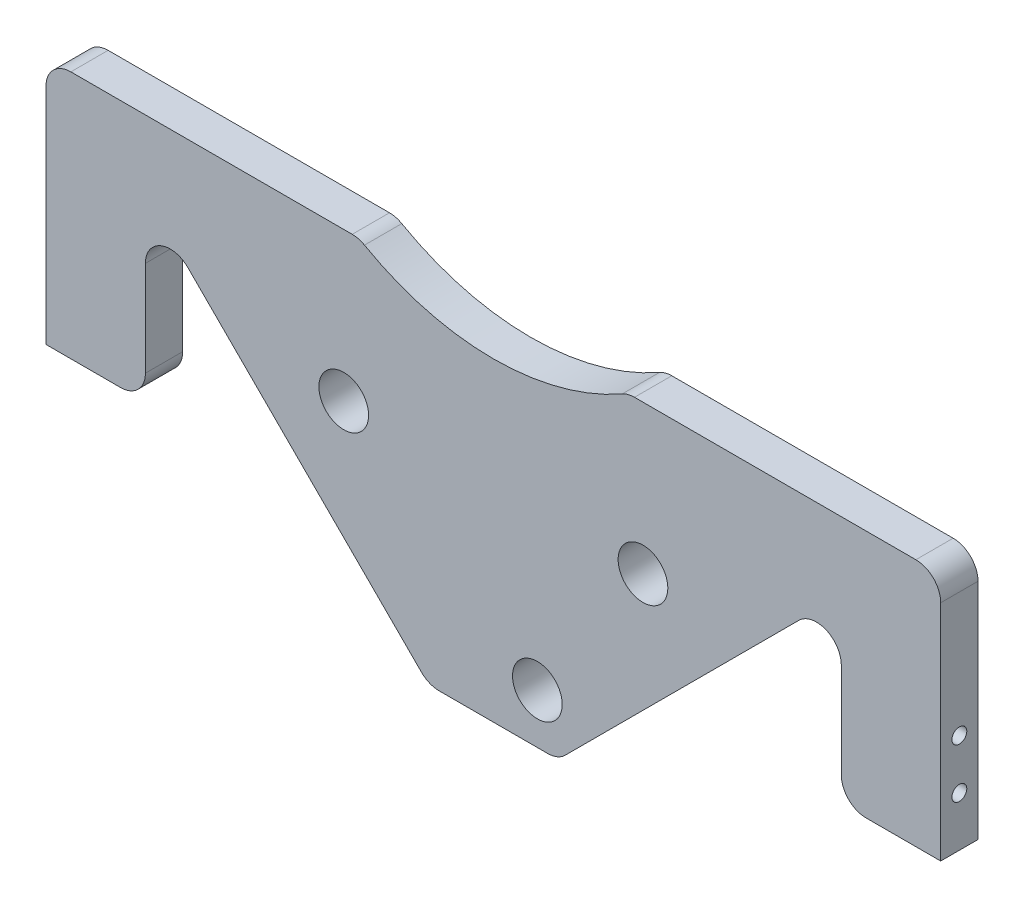
ISO-10303-21;
HEADER;
FILE_DESCRIPTION(('STEP AP214'),'2;1');
FILE_NAME('part.step','',(''),(''),'','','');
FILE_SCHEMA(('AUTOMOTIVE_DESIGN { 1 0 10303 214 1 1 1 1 }'));
ENDSEC;
DATA;
#1=APPLICATION_CONTEXT('core data for automotive mechanical design processes');
#2=APPLICATION_PROTOCOL_DEFINITION('international standard','automotive_design',2000,#1);
#3=PRODUCT_CONTEXT('',#1,'mechanical');
#4=PRODUCT('Part','Part','',(#3));
#5=PRODUCT_RELATED_PRODUCT_CATEGORY('part','',(#4));
#6=PRODUCT_DEFINITION_FORMATION('','',#4);
#7=PRODUCT_DEFINITION_CONTEXT('part definition',#1,'design');
#8=PRODUCT_DEFINITION('design','',#6,#7);
#9=PRODUCT_DEFINITION_SHAPE('','',#8);
#10=(LENGTH_UNIT() NAMED_UNIT(*) SI_UNIT(.MILLI.,.METRE.));
#11=(NAMED_UNIT(*) PLANE_ANGLE_UNIT() SI_UNIT($,.RADIAN.));
#12=(NAMED_UNIT(*) SI_UNIT($,.STERADIAN.) SOLID_ANGLE_UNIT());
#13=UNCERTAINTY_MEASURE_WITH_UNIT(LENGTH_MEASURE(1.E-05),#10,'distance_accuracy_value','');
#14=(GEOMETRIC_REPRESENTATION_CONTEXT(3) GLOBAL_UNCERTAINTY_ASSIGNED_CONTEXT((#13)) GLOBAL_UNIT_ASSIGNED_CONTEXT((#10,
#11,#12)) REPRESENTATION_CONTEXT('',''));
#15=CARTESIAN_POINT('',(0.,0.,0.));
#16=DIRECTION('',(0.,0.,1.));
#17=DIRECTION('',(1.,0.,0.));
#18=AXIS2_PLACEMENT_3D('',#15,#16,#17);
#19=CARTESIAN_POINT('',(-114.3,123.2,9.525));
#20=DIRECTION('',(0.,-1.,0.));
#21=DIRECTION('',(0.,0.,-1.));
#22=AXIS2_PLACEMENT_3D('',#19,#20,#21);
#23=PLANE('',#22);
#24=DIRECTION('',(-1.,0.,0.));
#25=VECTOR('',#24,1.);
#26=CARTESIAN_POINT('',(-114.3,123.2,9.525));
#27=LINE('',#26,#25);
#28=CARTESIAN_POINT('',(-36.0610679958317,123.2,9.525));
#29=VERTEX_POINT('',#28);
#30=CARTESIAN_POINT('',(-107.95,123.2,9.525));
#31=VERTEX_POINT('',#30);
#32=EDGE_CURVE('E287',#29,#31,#27,.T.);
#33=ORIENTED_EDGE('',*,*,#32,.F.);
#34=DIRECTION('',(0.,0.,-1.));
#35=VECTOR('',#34,1.);
#36=CARTESIAN_POINT('',(-36.0610679958317,123.2,9.525));
#37=LINE('',#36,#35);
#38=CARTESIAN_POINT('',(-36.0610679958317,123.2,0.));
#39=VERTEX_POINT('',#38);
#40=EDGE_CURVE('E389',#29,#39,#37,.T.);
#41=ORIENTED_EDGE('',*,*,#40,.T.);
#42=DIRECTION('',(-1.,0.,0.));
#43=VECTOR('',#42,1.);
#44=CARTESIAN_POINT('',(-114.3,123.2,0.));
#45=LINE('',#44,#43);
#46=CARTESIAN_POINT('',(-107.95,123.2,0.));
#47=VERTEX_POINT('',#46);
#48=EDGE_CURVE('E308',#39,#47,#45,.T.);
#49=ORIENTED_EDGE('',*,*,#48,.T.);
#50=DIRECTION('',(0.,0.,-1.));
#51=VECTOR('',#50,1.);
#52=CARTESIAN_POINT('',(-107.95,123.2,9.525));
#53=LINE('',#52,#51);
#54=EDGE_CURVE('E60',#47,#31,#53,.F.);
#55=ORIENTED_EDGE('',*,*,#54,.T.);
#56=EDGE_LOOP('',(#33,#41,#49,#55));
#57=FACE_BOUND('',#56,.T.);
#58=ADVANCED_FACE('F37',(#57),#23,.F.);
#59=CARTESIAN_POINT('',(-114.3,123.2,9.525));
#60=DIRECTION('',(1.,0.,0.));
#61=DIRECTION('',(0.,1.,0.));
#62=AXIS2_PLACEMENT_3D('',#59,#60,#61);
#63=PLANE('',#62);
#64=CARTESIAN_POINT('',(-114.3,85.1,4.7625));
#65=DIRECTION('',(-1.,0.,0.));
#66=DIRECTION('',(0.,0.,1.));
#67=AXIS2_PLACEMENT_3D('',#64,#65,#66);
#68=CIRCLE('',#67,1.89865);
#69=CARTESIAN_POINT('',(-114.3,85.1,6.66115000000001));
#70=VERTEX_POINT('',#69);
#71=EDGE_CURVE('E218',#70,#70,#68,.T.);
#72=ORIENTED_EDGE('',*,*,#71,.F.);
#73=EDGE_LOOP('',(#72));
#74=FACE_BOUND('',#73,.T.);
#75=CARTESIAN_POINT('',(-114.3,72.4,4.76250000000001));
#76=DIRECTION('',(-1.,0.,0.));
#77=DIRECTION('',(0.,0.,1.));
#78=AXIS2_PLACEMENT_3D('',#75,#76,#77);
#79=CIRCLE('',#78,1.89865);
#80=CARTESIAN_POINT('',(-114.3,72.4,6.66115000000001));
#81=VERTEX_POINT('',#80);
#82=EDGE_CURVE('E224',#81,#81,#79,.T.);
#83=ORIENTED_EDGE('',*,*,#82,.F.);
#84=EDGE_LOOP('',(#83));
#85=FACE_BOUND('',#84,.T.);
#86=DIRECTION('',(0.,-1.,0.));
#87=VECTOR('',#86,1.);
#88=CARTESIAN_POINT('',(-114.3,123.2,9.525));
#89=LINE('',#88,#87);
#90=CARTESIAN_POINT('',(-114.3,116.85,9.525));
#91=VERTEX_POINT('',#90);
#92=CARTESIAN_POINT('',(-114.3,59.7,9.525));
#93=VERTEX_POINT('',#92);
#94=EDGE_CURVE('E267',#91,#93,#89,.T.);
#95=ORIENTED_EDGE('',*,*,#94,.F.);
#96=DIRECTION('',(0.,0.,-1.));
#97=VECTOR('',#96,1.);
#98=CARTESIAN_POINT('',(-114.3,116.85,9.525));
#99=LINE('',#98,#97);
#100=CARTESIAN_POINT('',(-114.3,116.85,0.));
#101=VERTEX_POINT('',#100);
#102=EDGE_CURVE('E392',#91,#101,#99,.T.);
#103=ORIENTED_EDGE('',*,*,#102,.T.);
#104=DIRECTION('',(0.,-1.,0.));
#105=VECTOR('',#104,1.);
#106=CARTESIAN_POINT('',(-114.3,123.2,0.));
#107=LINE('',#106,#105);
#108=CARTESIAN_POINT('',(-114.3,59.7,0.));
#109=VERTEX_POINT('',#108);
#110=EDGE_CURVE('E266',#101,#109,#107,.T.);
#111=ORIENTED_EDGE('',*,*,#110,.T.);
#112=DIRECTION('',(0.,0.,-1.));
#113=VECTOR('',#112,1.);
#114=CARTESIAN_POINT('',(-114.3,59.7,9.525));
#115=LINE('',#114,#113);
#116=EDGE_CURVE('E314',#93,#109,#115,.T.);
#117=ORIENTED_EDGE('',*,*,#116,.F.);
#118=EDGE_LOOP('',(#95,#103,#111,#117));
#119=FACE_BOUND('',#118,.T.);
#120=ADVANCED_FACE('F463',(#74,#85,#119),#63,.F.);
#121=CARTESIAN_POINT('',(-114.3,59.7,9.525));
#122=DIRECTION('',(0.,1.,0.));
#123=DIRECTION('',(-1.,0.,0.));
#124=AXIS2_PLACEMENT_3D('',#121,#122,#123);
#125=PLANE('',#124);
#126=DIRECTION('',(1.,0.,0.));
#127=VECTOR('',#126,1.);
#128=CARTESIAN_POINT('',(-114.3,59.7,0.));
#129=LINE('',#128,#127);
#130=CARTESIAN_POINT('',(-95.25,59.7,0.));
#131=VERTEX_POINT('',#130);
#132=EDGE_CURVE('E291',#109,#131,#129,.T.);
#133=ORIENTED_EDGE('',*,*,#132,.T.);
#134=DIRECTION('',(0.,0.,-1.));
#135=VECTOR('',#134,1.);
#136=CARTESIAN_POINT('',(-95.25,59.7,9.525));
#137=LINE('',#136,#135);
#138=CARTESIAN_POINT('',(-95.25,59.7,9.525));
#139=VERTEX_POINT('',#138);
#140=EDGE_CURVE('E343',#131,#139,#137,.F.);
#141=ORIENTED_EDGE('',*,*,#140,.T.);
#142=DIRECTION('',(1.,0.,0.));
#143=VECTOR('',#142,1.);
#144=CARTESIAN_POINT('',(-114.3,59.7,9.525));
#145=LINE('',#144,#143);
#146=EDGE_CURVE('E269',#93,#139,#145,.T.);
#147=ORIENTED_EDGE('',*,*,#146,.F.);
#148=ORIENTED_EDGE('',*,*,#116,.T.);
#149=EDGE_LOOP('',(#133,#141,#147,#148));
#150=FACE_BOUND('',#149,.T.);
#151=ADVANCED_FACE('F468',(#150),#125,.F.);
#152=CARTESIAN_POINT('',(-16.5000122421383,33.2865174755712,9.525));
#153=DIRECTION('',(0.707106781186549,0.707106781186546,0.));
#154=DIRECTION('',(-0.707106781186546,0.707106781186549,0.));
#155=AXIS2_PLACEMENT_3D('',#152,#153,#154);
#156=PLANE('',#155);
#157=DIRECTION('',(0.707106781186546,-0.707106781186549,0.));
#158=VECTOR('',#157,1.);
#159=CARTESIAN_POINT('',(-16.5000122421383,33.2865174755712,9.525));
#160=LINE('',#159,#158);
#161=CARTESIAN_POINT('',(-78.0598719394654,94.8463771728986,9.525));
#162=VERTEX_POINT('',#161);
#163=CARTESIAN_POINT('',(-18.3598841816037,35.1463894150367,9.525));
#164=VERTEX_POINT('',#163);
#165=EDGE_CURVE('E273',#162,#164,#160,.T.);
#166=ORIENTED_EDGE('',*,*,#165,.F.);
#167=DIRECTION('',(0.,0.,-1.));
#168=VECTOR('',#167,1.);
#169=CARTESIAN_POINT('',(-78.0598719394654,94.8463771728986,0.));
#170=LINE('',#169,#168);
#171=CARTESIAN_POINT('',(-78.0598719394654,94.8463771728986,0.));
#172=VERTEX_POINT('',#171);
#173=EDGE_CURVE('E319',#162,#172,#170,.T.);
#174=ORIENTED_EDGE('',*,*,#173,.T.);
#175=DIRECTION('',(0.707106781186546,-0.707106781186549,0.));
#176=VECTOR('',#175,1.);
#177=CARTESIAN_POINT('',(-16.5000122421383,33.2865174755712,0.));
#178=LINE('',#177,#176);
#179=CARTESIAN_POINT('',(-18.3598841816037,35.1463894150367,0.));
#180=VERTEX_POINT('',#179);
#181=EDGE_CURVE('E294',#172,#180,#178,.T.);
#182=ORIENTED_EDGE('',*,*,#181,.T.);
#183=DIRECTION('',(0.,0.,-1.));
#184=VECTOR('',#183,1.);
#185=CARTESIAN_POINT('',(-18.3598841816037,35.1463894150367,9.525));
#186=LINE('',#185,#184);
#187=EDGE_CURVE('E317',#180,#164,#186,.F.);
#188=ORIENTED_EDGE('',*,*,#187,.T.);
#189=EDGE_LOOP('',(#166,#174,#182,#188));
#190=FACE_BOUND('',#189,.T.);
#191=ADVANCED_FACE('F484',(#190),#156,.F.);
#192=CARTESIAN_POINT('',(-16.5000122421383,33.2865174755712,9.525));
#193=DIRECTION('',(0.,1.,0.));
#194=DIRECTION('',(0.,0.,1.));
#195=AXIS2_PLACEMENT_3D('',#192,#193,#194);
#196=PLANE('',#195);
#197=DIRECTION('',(1.,0.,0.));
#198=VECTOR('',#197,1.);
#199=CARTESIAN_POINT('',(-16.5000122421383,33.2865174755712,0.));
#200=LINE('',#199,#198);
#201=CARTESIAN_POINT('',(-13.8697561210692,33.2865174755712,0.));
#202=VERTEX_POINT('',#201);
#203=CARTESIAN_POINT('',(13.8697561210692,33.2865174755712,0.));
#204=VERTEX_POINT('',#203);
#205=EDGE_CURVE('E297',#202,#204,#200,.T.);
#206=ORIENTED_EDGE('',*,*,#205,.T.);
#207=DIRECTION('',(0.,0.,-1.));
#208=VECTOR('',#207,1.);
#209=CARTESIAN_POINT('',(13.8697561210692,33.2865174755712,9.525));
#210=LINE('',#209,#208);
#211=CARTESIAN_POINT('',(13.8697561210692,33.2865174755712,9.525));
#212=VERTEX_POINT('',#211);
#213=EDGE_CURVE('E376',#204,#212,#210,.F.);
#214=ORIENTED_EDGE('',*,*,#213,.T.);
#215=DIRECTION('',(1.,0.,0.));
#216=VECTOR('',#215,1.);
#217=CARTESIAN_POINT('',(-16.5000122421383,33.2865174755712,9.525));
#218=LINE('',#217,#216);
#219=CARTESIAN_POINT('',(-13.8697561210692,33.2865174755712,9.525));
#220=VERTEX_POINT('',#219);
#221=EDGE_CURVE('E276',#220,#212,#218,.T.);
#222=ORIENTED_EDGE('',*,*,#221,.F.);
#223=DIRECTION('',(0.,0.,-1.));
#224=VECTOR('',#223,1.);
#225=CARTESIAN_POINT('',(-13.8697561210692,33.2865174755712,9.525));
#226=LINE('',#225,#224);
#227=EDGE_CURVE('E373',#220,#202,#226,.T.);
#228=ORIENTED_EDGE('',*,*,#227,.T.);
#229=EDGE_LOOP('',(#206,#214,#222,#228));
#230=FACE_BOUND('',#229,.T.);
#231=ADVANCED_FACE('F493',(#230),#196,.F.);
#232=CARTESIAN_POINT('',(16.5000122421383,33.2865174755712,9.525));
#233=DIRECTION('',(-0.707106781186549,0.707106781186546,0.));
#234=DIRECTION('',(-0.707106781186546,-0.707106781186549,0.));
#235=AXIS2_PLACEMENT_3D('',#232,#233,#234);
#236=PLANE('',#235);
#237=DIRECTION('',(0.707106781186546,0.707106781186549,0.));
#238=VECTOR('',#237,1.);
#239=CARTESIAN_POINT('',(16.5000122421383,33.2865174755712,0.));
#240=LINE('',#239,#238);
#241=CARTESIAN_POINT('',(18.3598841816037,35.1463894150367,0.));
#242=VERTEX_POINT('',#241);
#243=CARTESIAN_POINT('',(78.0598719394655,94.8463771728986,0.));
#244=VERTEX_POINT('',#243);
#245=EDGE_CURVE('E300',#242,#244,#240,.T.);
#246=ORIENTED_EDGE('',*,*,#245,.T.);
#247=DIRECTION('',(0.,0.,-1.));
#248=VECTOR('',#247,1.);
#249=CARTESIAN_POINT('',(78.0598719394655,94.8463771728986,9.525));
#250=LINE('',#249,#248);
#251=CARTESIAN_POINT('',(78.0598719394655,94.8463771728986,9.525));
#252=VERTEX_POINT('',#251);
#253=EDGE_CURVE('E368',#244,#252,#250,.F.);
#254=ORIENTED_EDGE('',*,*,#253,.T.);
#255=DIRECTION('',(0.707106781186546,0.707106781186549,0.));
#256=VECTOR('',#255,1.);
#257=CARTESIAN_POINT('',(16.5000122421383,33.2865174755712,9.525));
#258=LINE('',#257,#256);
#259=CARTESIAN_POINT('',(18.3598841816037,35.1463894150367,9.525));
#260=VERTEX_POINT('',#259);
#261=EDGE_CURVE('E279',#260,#252,#258,.T.);
#262=ORIENTED_EDGE('',*,*,#261,.F.);
#263=DIRECTION('',(0.,0.,-1.));
#264=VECTOR('',#263,1.);
#265=CARTESIAN_POINT('',(18.3598841816037,35.1463894150367,9.525));
#266=LINE('',#265,#264);
#267=EDGE_CURVE('E365',#260,#242,#266,.T.);
#268=ORIENTED_EDGE('',*,*,#267,.T.);
#269=EDGE_LOOP('',(#246,#254,#262,#268));
#270=FACE_BOUND('',#269,.T.);
#271=ADVANCED_FACE('F409',(#270),#236,.F.);
#272=CARTESIAN_POINT('',(42.913494766567,59.7,9.525));
#273=DIRECTION('',(0.,1.,0.));
#274=DIRECTION('',(0.,0.,1.));
#275=AXIS2_PLACEMENT_3D('',#272,#273,#274);
#276=PLANE('',#275);
#277=DIRECTION('',(1.,0.,0.));
#278=VECTOR('',#277,1.);
#279=CARTESIAN_POINT('',(42.913494766567,59.7,9.525));
#280=LINE('',#279,#278);
#281=CARTESIAN_POINT('',(95.25,59.7,9.525));
#282=VERTEX_POINT('',#281);
#283=CARTESIAN_POINT('',(114.3,59.7,9.525));
#284=VERTEX_POINT('',#283);
#285=EDGE_CURVE('E282',#282,#284,#280,.T.);
#286=ORIENTED_EDGE('',*,*,#285,.F.);
#287=DIRECTION('',(0.,0.,-1.));
#288=VECTOR('',#287,1.);
#289=CARTESIAN_POINT('',(95.25,59.7,9.525));
#290=LINE('',#289,#288);
#291=CARTESIAN_POINT('',(95.25,59.7,0.));
#292=VERTEX_POINT('',#291);
#293=EDGE_CURVE('E370',#282,#292,#290,.T.);
#294=ORIENTED_EDGE('',*,*,#293,.T.);
#295=DIRECTION('',(1.,0.,0.));
#296=VECTOR('',#295,1.);
#297=CARTESIAN_POINT('',(42.913494766567,59.7,0.));
#298=LINE('',#297,#296);
#299=CARTESIAN_POINT('',(114.3,59.7,0.));
#300=VERTEX_POINT('',#299);
#301=EDGE_CURVE('E303',#292,#300,#298,.T.);
#302=ORIENTED_EDGE('',*,*,#301,.T.);
#303=DIRECTION('',(0.,0.,-1.));
#304=VECTOR('',#303,1.);
#305=CARTESIAN_POINT('',(114.3,59.7,9.525));
#306=LINE('',#305,#304);
#307=EDGE_CURVE('E311',#284,#300,#306,.T.);
#308=ORIENTED_EDGE('',*,*,#307,.F.);
#309=EDGE_LOOP('',(#286,#294,#302,#308));
#310=FACE_BOUND('',#309,.T.);
#311=ADVANCED_FACE('F427',(#310),#276,.F.);
#312=CARTESIAN_POINT('',(114.3,123.2,9.525));
#313=DIRECTION('',(-1.,0.,0.));
#314=DIRECTION('',(0.,-1.,0.));
#315=AXIS2_PLACEMENT_3D('',#312,#313,#314);
#316=PLANE('',#315);
#317=CARTESIAN_POINT('',(114.3,85.1,4.7625));
#318=DIRECTION('',(1.,0.,0.));
#319=DIRECTION('',(0.,0.,-1.));
#320=AXIS2_PLACEMENT_3D('',#317,#318,#319);
#321=CIRCLE('',#320,1.89865);
#322=CARTESIAN_POINT('',(114.3,85.1,2.86385));
#323=VERTEX_POINT('',#322);
#324=EDGE_CURVE('E208',#323,#323,#321,.T.);
#325=ORIENTED_EDGE('',*,*,#324,.F.);
#326=EDGE_LOOP('',(#325));
#327=FACE_BOUND('',#326,.T.);
#328=CARTESIAN_POINT('',(114.3,72.4,4.76250000000001));
#329=DIRECTION('',(1.,0.,0.));
#330=DIRECTION('',(0.,0.,-1.));
#331=AXIS2_PLACEMENT_3D('',#328,#329,#330);
#332=CIRCLE('',#331,1.89865);
#333=CARTESIAN_POINT('',(114.3,72.4,2.86385));
#334=VERTEX_POINT('',#333);
#335=EDGE_CURVE('E207',#334,#334,#332,.T.);
#336=ORIENTED_EDGE('',*,*,#335,.F.);
#337=EDGE_LOOP('',(#336));
#338=FACE_BOUND('',#337,.T.);
#339=DIRECTION('',(0.,1.,0.));
#340=VECTOR('',#339,1.);
#341=CARTESIAN_POINT('',(114.3,123.2,0.));
#342=LINE('',#341,#340);
#343=CARTESIAN_POINT('',(114.3,116.85,0.));
#344=VERTEX_POINT('',#343);
#345=EDGE_CURVE('E305',#300,#344,#342,.T.);
#346=ORIENTED_EDGE('',*,*,#345,.T.);
#347=DIRECTION('',(0.,0.,-1.));
#348=VECTOR('',#347,1.);
#349=CARTESIAN_POINT('',(114.3,116.85,9.525));
#350=LINE('',#349,#348);
#351=CARTESIAN_POINT('',(114.3,116.85,9.525));
#352=VERTEX_POINT('',#351);
#353=EDGE_CURVE('E395',#344,#352,#350,.F.);
#354=ORIENTED_EDGE('',*,*,#353,.T.);
#355=DIRECTION('',(0.,1.,0.));
#356=VECTOR('',#355,1.);
#357=CARTESIAN_POINT('',(114.3,123.2,9.525));
#358=LINE('',#357,#356);
#359=EDGE_CURVE('E284',#284,#352,#358,.T.);
#360=ORIENTED_EDGE('',*,*,#359,.F.);
#361=ORIENTED_EDGE('',*,*,#307,.T.);
#362=EDGE_LOOP('',(#346,#354,#360,#361));
#363=FACE_BOUND('',#362,.T.);
#364=ADVANCED_FACE('F432',(#327,#338,#363),#316,.F.);
#365=CARTESIAN_POINT('',(107.95,123.2,0.));
#366=VERTEX_POINT('',#365);
#367=CARTESIAN_POINT('',(36.0610679958317,123.2,0.));
#368=VERTEX_POINT('',#367);
#369=EDGE_CURVE('E270',#366,#368,#45,.T.);
#370=ORIENTED_EDGE('',*,*,#369,.T.);
#371=DIRECTION('',(0.,0.,-1.));
#372=VECTOR('',#371,1.);
#373=CARTESIAN_POINT('',(36.0610679958317,123.2,9.525));
#374=LINE('',#373,#372);
#375=CARTESIAN_POINT('',(36.0610679958317,123.2,9.525));
#376=VERTEX_POINT('',#375);
#377=EDGE_CURVE('E381',#368,#376,#374,.F.);
#378=ORIENTED_EDGE('',*,*,#377,.T.);
#379=CARTESIAN_POINT('',(107.95,123.2,9.525));
#380=VERTEX_POINT('',#379);
#381=EDGE_CURVE('E289',#380,#376,#27,.T.);
#382=ORIENTED_EDGE('',*,*,#381,.F.);
#383=DIRECTION('',(0.,0.,-1.));
#384=VECTOR('',#383,1.);
#385=CARTESIAN_POINT('',(107.95,123.2,9.525));
#386=LINE('',#385,#384);
#387=EDGE_CURVE('E378',#380,#366,#386,.T.);
#388=ORIENTED_EDGE('',*,*,#387,.T.);
#389=EDGE_LOOP('',(#370,#378,#382,#388));
#390=FACE_BOUND('',#389,.T.);
#391=ADVANCED_FACE('F441',(#390),#23,.F.);
#392=CARTESIAN_POINT('',(0.,0.,9.525));
#393=DIRECTION('',(0.,0.,1.));
#394=DIRECTION('',(1.,0.,0.));
#395=AXIS2_PLACEMENT_3D('',#392,#393,#394);
#396=PLANE('',#395);
#397=ORIENTED_EDGE('',*,*,#146,.T.);
#398=CARTESIAN_POINT('',(-95.25,66.05,9.525));
#399=DIRECTION('',(0.,0.,1.));
#400=DIRECTION('',(1.,0.,0.));
#401=AXIS2_PLACEMENT_3D('',#398,#399,#400);
#402=CIRCLE('',#401,6.35);
#403=CARTESIAN_POINT('',(-88.9,66.05,9.525));
#404=VERTEX_POINT('',#403);
#405=EDGE_CURVE('E358',#139,#404,#402,.T.);
#406=ORIENTED_EDGE('',*,*,#405,.T.);
#407=DIRECTION('',(0.,1.,0.));
#408=VECTOR('',#407,1.);
#409=CARTESIAN_POINT('',(-88.9,105.686505233433,9.525));
#410=LINE('',#409,#408);
#411=CARTESIAN_POINT('',(-88.9,90.3562491123641,9.525));
#412=VERTEX_POINT('',#411);
#413=EDGE_CURVE('E231',#404,#412,#410,.T.);
#414=ORIENTED_EDGE('',*,*,#413,.T.);
#415=CARTESIAN_POINT('',(-82.55,90.3562491123641,9.525));
#416=DIRECTION('',(0.,0.,1.));
#417=DIRECTION('',(1.,0.,0.));
#418=AXIS2_PLACEMENT_3D('',#415,#416,#417);
#419=CIRCLE('',#418,6.35);
#420=EDGE_CURVE('E399',#412,#162,#419,.F.);
#421=ORIENTED_EDGE('',*,*,#420,.T.);
#422=ORIENTED_EDGE('',*,*,#165,.T.);
#423=CARTESIAN_POINT('',(-13.8697561210692,39.6365174755712,9.525));
#424=DIRECTION('',(0.,0.,1.));
#425=DIRECTION('',(1.,0.,0.));
#426=AXIS2_PLACEMENT_3D('',#423,#424,#425);
#427=CIRCLE('',#426,6.35);
#428=EDGE_CURVE('E352',#164,#220,#427,.T.);
#429=ORIENTED_EDGE('',*,*,#428,.T.);
#430=ORIENTED_EDGE('',*,*,#221,.T.);
#431=CARTESIAN_POINT('',(13.8697561210692,39.6365174755712,9.525));
#432=DIRECTION('',(0.,0.,1.));
#433=DIRECTION('',(1.,0.,0.));
#434=AXIS2_PLACEMENT_3D('',#431,#432,#433);
#435=CIRCLE('',#434,6.35);
#436=EDGE_CURVE('E354',#212,#260,#435,.T.);
#437=ORIENTED_EDGE('',*,*,#436,.T.);
#438=ORIENTED_EDGE('',*,*,#261,.T.);
#439=CARTESIAN_POINT('',(82.55,90.356249112364,9.525));
#440=DIRECTION('',(0.,0.,1.));
#441=DIRECTION('',(1.,0.,0.));
#442=AXIS2_PLACEMENT_3D('',#439,#440,#441);
#443=CIRCLE('',#442,6.35);
#444=CARTESIAN_POINT('',(88.9,90.356249112364,9.525));
#445=VERTEX_POINT('',#444);
#446=EDGE_CURVE('E11',#252,#445,#443,.F.);
#447=ORIENTED_EDGE('',*,*,#446,.T.);
#448=DIRECTION('',(0.,-1.,0.));
#449=VECTOR('',#448,1.);
#450=CARTESIAN_POINT('',(88.9,105.686505233433,9.525));
#451=LINE('',#450,#449);
#452=CARTESIAN_POINT('',(88.9,66.05,9.525));
#453=VERTEX_POINT('',#452);
#454=EDGE_CURVE('E238',#445,#453,#451,.T.);
#455=ORIENTED_EDGE('',*,*,#454,.T.);
#456=CARTESIAN_POINT('',(95.25,66.05,9.525));
#457=DIRECTION('',(0.,0.,1.));
#458=DIRECTION('',(1.,0.,0.));
#459=AXIS2_PLACEMENT_3D('',#456,#457,#458);
#460=CIRCLE('',#459,6.35);
#461=EDGE_CURVE('E356',#453,#282,#460,.T.);
#462=ORIENTED_EDGE('',*,*,#461,.T.);
#463=ORIENTED_EDGE('',*,*,#285,.T.);
#464=ORIENTED_EDGE('',*,*,#359,.T.);
#465=CARTESIAN_POINT('',(107.95,116.85,9.525));
#466=DIRECTION('',(0.,0.,1.));
#467=DIRECTION('',(1.,0.,0.));
#468=AXIS2_PLACEMENT_3D('',#465,#466,#467);
#469=CIRCLE('',#468,6.35);
#470=EDGE_CURVE('E345',#352,#380,#469,.T.);
#471=ORIENTED_EDGE('',*,*,#470,.T.);
#472=ORIENTED_EDGE('',*,*,#381,.T.);
#473=CARTESIAN_POINT('',(36.0610679958317,116.85,9.525));
#474=DIRECTION('',(0.,0.,1.));
#475=DIRECTION('',(1.,0.,0.));
#476=AXIS2_PLACEMENT_3D('',#473,#474,#475);
#477=CIRCLE('',#476,6.35);
#478=CARTESIAN_POINT('',(32.9253229527159,122.371739130435,9.525));
#479=VERTEX_POINT('',#478);
#480=EDGE_CURVE('E350',#376,#479,#477,.T.);
#481=ORIENTED_EDGE('',*,*,#480,.T.);
#482=CARTESIAN_POINT('',(0.,180.35,9.525));
#483=DIRECTION('',(0.,0.,-1.));
#484=DIRECTION('',(-1.,0.,0.));
#485=AXIS2_PLACEMENT_3D('',#482,#483,#484);
#486=CIRCLE('',#485,66.675);
#487=CARTESIAN_POINT('',(-32.9253229527159,122.371739130435,9.525));
#488=VERTEX_POINT('',#487);
#489=EDGE_CURVE('E243',#479,#488,#486,.T.);
#490=ORIENTED_EDGE('',*,*,#489,.T.);
#491=CARTESIAN_POINT('',(-36.0610679958317,116.85,9.525));
#492=DIRECTION('',(0.,0.,1.));
#493=DIRECTION('',(1.,0.,0.));
#494=AXIS2_PLACEMENT_3D('',#491,#492,#493);
#495=CIRCLE('',#494,6.35);
#496=EDGE_CURVE('E348',#488,#29,#495,.T.);
#497=ORIENTED_EDGE('',*,*,#496,.T.);
#498=ORIENTED_EDGE('',*,*,#32,.T.);
#499=CARTESIAN_POINT('',(-107.95,116.85,9.525));
#500=DIRECTION('',(0.,0.,1.));
#501=DIRECTION('',(1.,0.,0.));
#502=AXIS2_PLACEMENT_3D('',#499,#500,#501);
#503=CIRCLE('',#502,6.35);
#504=EDGE_CURVE('E52',#31,#91,#503,.T.);
#505=ORIENTED_EDGE('',*,*,#504,.T.);
#506=ORIENTED_EDGE('',*,*,#94,.T.);
#507=EDGE_LOOP('',(#397,#406,#414,#421,#422,#429,#430,#437,#438,#447,#455,#462,#463,#464,#471,
#472,#481,#490,#497,#498,#505,#506));
#508=FACE_BOUND('',#507,.T.);
#509=CARTESIAN_POINT('',(-38.227,85.227,9.525));
#510=DIRECTION('',(0.,0.,1.));
#511=DIRECTION('',(1.,0.,0.));
#512=AXIS2_PLACEMENT_3D('',#509,#510,#511);
#513=CIRCLE('',#512,6.35);
#514=CARTESIAN_POINT('',(-31.877,85.227,9.525));
#515=VERTEX_POINT('',#514);
#516=EDGE_CURVE('E246',#515,#515,#513,.T.);
#517=ORIENTED_EDGE('',*,*,#516,.F.);
#518=EDGE_LOOP('',(#517));
#519=FACE_BOUND('',#518,.T.);
#520=CARTESIAN_POINT('',(38.227,85.227,9.525));
#521=DIRECTION('',(0.,0.,1.));
#522=DIRECTION('',(1.,0.,0.));
#523=AXIS2_PLACEMENT_3D('',#520,#521,#522);
#524=CIRCLE('',#523,6.35);
#525=CARTESIAN_POINT('',(44.577,85.227,9.525));
#526=VERTEX_POINT('',#525);
#527=EDGE_CURVE('E254',#526,#526,#524,.T.);
#528=ORIENTED_EDGE('',*,*,#527,.F.);
#529=EDGE_LOOP('',(#528));
#530=FACE_BOUND('',#529,.T.);
#531=CARTESIAN_POINT('',(11.2395,45.9865174755712,9.525));
#532=DIRECTION('',(0.,0.,1.));
#533=DIRECTION('',(1.,0.,0.));
#534=AXIS2_PLACEMENT_3D('',#531,#532,#533);
#535=CIRCLE('',#534,6.35);
#536=CARTESIAN_POINT('',(17.5895,45.9865174755712,9.525));
#537=VERTEX_POINT('',#536);
#538=EDGE_CURVE('E260',#537,#537,#535,.T.);
#539=ORIENTED_EDGE('',*,*,#538,.F.);
#540=EDGE_LOOP('',(#539));
#541=FACE_BOUND('',#540,.T.);
#542=ADVANCED_FACE('F415',(#508,#519,#530,#541),#396,.T.);
#543=CARTESIAN_POINT('',(0.,0.,0.));
#544=DIRECTION('',(0.,0.,1.));
#545=DIRECTION('',(1.,0.,0.));
#546=AXIS2_PLACEMENT_3D('',#543,#544,#545);
#547=PLANE('',#546);
#548=CARTESIAN_POINT('',(-38.227,85.227,0.));
#549=DIRECTION('',(0.,0.,1.));
#550=DIRECTION('',(1.,0.,0.));
#551=AXIS2_PLACEMENT_3D('',#548,#549,#550);
#552=CIRCLE('',#551,6.35);
#553=CARTESIAN_POINT('',(-31.877,85.227,0.));
#554=VERTEX_POINT('',#553);
#555=EDGE_CURVE('E251',#554,#554,#552,.T.);
#556=ORIENTED_EDGE('',*,*,#555,.T.);
#557=EDGE_LOOP('',(#556));
#558=FACE_BOUND('',#557,.T.);
#559=CARTESIAN_POINT('',(38.227,85.227,0.));
#560=DIRECTION('',(0.,0.,1.));
#561=DIRECTION('',(1.,0.,0.));
#562=AXIS2_PLACEMENT_3D('',#559,#560,#561);
#563=CIRCLE('',#562,6.35);
#564=CARTESIAN_POINT('',(44.577,85.227,0.));
#565=VERTEX_POINT('',#564);
#566=EDGE_CURVE('E257',#565,#565,#563,.T.);
#567=ORIENTED_EDGE('',*,*,#566,.T.);
#568=EDGE_LOOP('',(#567));
#569=FACE_BOUND('',#568,.T.);
#570=CARTESIAN_POINT('',(11.2395,45.9865174755712,0.));
#571=DIRECTION('',(0.,0.,1.));
#572=DIRECTION('',(1.,0.,0.));
#573=AXIS2_PLACEMENT_3D('',#570,#571,#572);
#574=CIRCLE('',#573,6.35);
#575=CARTESIAN_POINT('',(17.5895,45.9865174755712,0.));
#576=VERTEX_POINT('',#575);
#577=EDGE_CURVE('E263',#576,#576,#574,.T.);
#578=ORIENTED_EDGE('',*,*,#577,.T.);
#579=EDGE_LOOP('',(#578));
#580=FACE_BOUND('',#579,.T.);
#581=DIRECTION('',(0.,1.,0.));
#582=VECTOR('',#581,1.);
#583=CARTESIAN_POINT('',(-88.9,105.686505233433,0.));
#584=LINE('',#583,#582);
#585=CARTESIAN_POINT('',(-88.9,66.05,0.));
#586=VERTEX_POINT('',#585);
#587=CARTESIAN_POINT('',(-88.9,90.3562491123641,0.));
#588=VERTEX_POINT('',#587);
#589=EDGE_CURVE('E235',#586,#588,#584,.T.);
#590=ORIENTED_EDGE('',*,*,#589,.F.);
#591=CARTESIAN_POINT('',(-95.25,66.05,0.));
#592=DIRECTION('',(0.,0.,1.));
#593=DIRECTION('',(1.,0.,0.));
#594=AXIS2_PLACEMENT_3D('',#591,#592,#593);
#595=CIRCLE('',#594,6.35);
#596=EDGE_CURVE('E341',#586,#131,#595,.F.);
#597=ORIENTED_EDGE('',*,*,#596,.T.);
#598=ORIENTED_EDGE('',*,*,#132,.F.);
#599=ORIENTED_EDGE('',*,*,#110,.F.);
#600=CARTESIAN_POINT('',(-107.95,116.85,0.));
#601=DIRECTION('',(0.,0.,1.));
#602=DIRECTION('',(1.,0.,0.));
#603=AXIS2_PLACEMENT_3D('',#600,#601,#602);
#604=CIRCLE('',#603,6.35);
#605=EDGE_CURVE('E329',#101,#47,#604,.F.);
#606=ORIENTED_EDGE('',*,*,#605,.T.);
#607=ORIENTED_EDGE('',*,*,#48,.F.);
#608=CARTESIAN_POINT('',(-36.0610679958317,116.85,0.));
#609=DIRECTION('',(0.,0.,1.));
#610=DIRECTION('',(1.,0.,0.));
#611=AXIS2_PLACEMENT_3D('',#608,#609,#610);
#612=CIRCLE('',#611,6.35);
#613=CARTESIAN_POINT('',(-32.9253229527159,122.371739130435,0.));
#614=VERTEX_POINT('',#613);
#615=EDGE_CURVE('E331',#39,#614,#612,.F.);
#616=ORIENTED_EDGE('',*,*,#615,.T.);
#617=CARTESIAN_POINT('',(0.,180.35,0.));
#618=DIRECTION('',(0.,0.,-1.));
#619=DIRECTION('',(-1.,0.,0.));
#620=AXIS2_PLACEMENT_3D('',#617,#618,#619);
#621=CIRCLE('',#620,66.675);
#622=CARTESIAN_POINT('',(32.9253229527159,122.371739130435,0.));
#623=VERTEX_POINT('',#622);
#624=EDGE_CURVE('E234',#623,#614,#621,.T.);
#625=ORIENTED_EDGE('',*,*,#624,.F.);
#626=CARTESIAN_POINT('',(36.0610679958317,116.85,0.));
#627=DIRECTION('',(0.,0.,1.));
#628=DIRECTION('',(1.,0.,0.));
#629=AXIS2_PLACEMENT_3D('',#626,#627,#628);
#630=CIRCLE('',#629,6.35);
#631=EDGE_CURVE('E333',#623,#368,#630,.F.);
#632=ORIENTED_EDGE('',*,*,#631,.T.);
#633=ORIENTED_EDGE('',*,*,#369,.F.);
#634=CARTESIAN_POINT('',(107.95,116.85,0.));
#635=DIRECTION('',(0.,0.,1.));
#636=DIRECTION('',(1.,0.,0.));
#637=AXIS2_PLACEMENT_3D('',#634,#635,#636);
#638=CIRCLE('',#637,6.35);
#639=EDGE_CURVE('E327',#366,#344,#638,.F.);
#640=ORIENTED_EDGE('',*,*,#639,.T.);
#641=ORIENTED_EDGE('',*,*,#345,.F.);
#642=ORIENTED_EDGE('',*,*,#301,.F.);
#643=CARTESIAN_POINT('',(95.25,66.05,0.));
#644=DIRECTION('',(0.,0.,1.));
#645=DIRECTION('',(1.,0.,0.));
#646=AXIS2_PLACEMENT_3D('',#643,#644,#645);
#647=CIRCLE('',#646,6.35);
#648=CARTESIAN_POINT('',(88.9,66.05,0.));
#649=VERTEX_POINT('',#648);
#650=EDGE_CURVE('E339',#292,#649,#647,.F.);
#651=ORIENTED_EDGE('',*,*,#650,.T.);
#652=DIRECTION('',(0.,-1.,0.));
#653=VECTOR('',#652,1.);
#654=CARTESIAN_POINT('',(88.9,105.686505233433,0.));
#655=LINE('',#654,#653);
#656=CARTESIAN_POINT('',(88.9,90.356249112364,0.));
#657=VERTEX_POINT('',#656);
#658=EDGE_CURVE('E230',#657,#649,#655,.T.);
#659=ORIENTED_EDGE('',*,*,#658,.F.);
#660=CARTESIAN_POINT('',(82.55,90.356249112364,0.));
#661=DIRECTION('',(0.,0.,1.));
#662=DIRECTION('',(1.,0.,0.));
#663=AXIS2_PLACEMENT_3D('',#660,#661,#662);
#664=CIRCLE('',#663,6.35);
#665=EDGE_CURVE('E45',#657,#244,#664,.T.);
#666=ORIENTED_EDGE('',*,*,#665,.T.);
#667=ORIENTED_EDGE('',*,*,#245,.F.);
#668=CARTESIAN_POINT('',(13.8697561210692,39.6365174755712,0.));
#669=DIRECTION('',(0.,0.,1.));
#670=DIRECTION('',(1.,0.,0.));
#671=AXIS2_PLACEMENT_3D('',#668,#669,#670);
#672=CIRCLE('',#671,6.35);
#673=EDGE_CURVE('E337',#242,#204,#672,.F.);
#674=ORIENTED_EDGE('',*,*,#673,.T.);
#675=ORIENTED_EDGE('',*,*,#205,.F.);
#676=CARTESIAN_POINT('',(-13.8697561210692,39.6365174755712,0.));
#677=DIRECTION('',(0.,0.,1.));
#678=DIRECTION('',(1.,0.,0.));
#679=AXIS2_PLACEMENT_3D('',#676,#677,#678);
#680=CIRCLE('',#679,6.35);
#681=EDGE_CURVE('E335',#202,#180,#680,.F.);
#682=ORIENTED_EDGE('',*,*,#681,.T.);
#683=ORIENTED_EDGE('',*,*,#181,.F.);
#684=CARTESIAN_POINT('',(-82.55,90.3562491123641,0.));
#685=DIRECTION('',(0.,0.,1.));
#686=DIRECTION('',(1.,0.,0.));
#687=AXIS2_PLACEMENT_3D('',#684,#685,#686);
#688=CIRCLE('',#687,6.35);
#689=EDGE_CURVE('E397',#172,#588,#688,.T.);
#690=ORIENTED_EDGE('',*,*,#689,.T.);
#691=EDGE_LOOP('',(#590,#597,#598,#599,#606,#607,#616,#625,#632,#633,#640,#641,#642,#651,#659,
#666,#667,#674,#675,#682,#683,#690));
#692=FACE_BOUND('',#691,.T.);
#693=ADVANCED_FACE('F404',(#558,#569,#580,#692),#547,.F.);
#694=CARTESIAN_POINT('',(11.2395,45.9865174755712,9.525));
#695=DIRECTION('',(0.,0.,1.));
#696=DIRECTION('',(1.,0.,0.));
#697=AXIS2_PLACEMENT_3D('',#694,#695,#696);
#698=CYLINDRICAL_SURFACE('',#697,6.35);
#699=ORIENTED_EDGE('',*,*,#577,.F.);
#700=EDGE_LOOP('',(#699));
#701=FACE_BOUND('',#700,.T.);
#702=ORIENTED_EDGE('',*,*,#538,.T.);
#703=EDGE_LOOP('',(#702));
#704=FACE_BOUND('',#703,.T.);
#705=ADVANCED_FACE('F702',(#701,#704),#698,.F.);
#706=CARTESIAN_POINT('',(38.227,85.227,9.525));
#707=DIRECTION('',(0.,0.,1.));
#708=DIRECTION('',(1.,0.,0.));
#709=AXIS2_PLACEMENT_3D('',#706,#707,#708);
#710=CYLINDRICAL_SURFACE('',#709,6.35);
#711=ORIENTED_EDGE('',*,*,#566,.F.);
#712=EDGE_LOOP('',(#711));
#713=FACE_BOUND('',#712,.T.);
#714=ORIENTED_EDGE('',*,*,#527,.T.);
#715=EDGE_LOOP('',(#714));
#716=FACE_BOUND('',#715,.T.);
#717=ADVANCED_FACE('F698',(#713,#716),#710,.F.);
#718=CARTESIAN_POINT('',(-38.227,85.227,9.525));
#719=DIRECTION('',(0.,0.,1.));
#720=DIRECTION('',(1.,0.,0.));
#721=AXIS2_PLACEMENT_3D('',#718,#719,#720);
#722=CYLINDRICAL_SURFACE('',#721,6.35);
#723=ORIENTED_EDGE('',*,*,#555,.F.);
#724=EDGE_LOOP('',(#723));
#725=FACE_BOUND('',#724,.T.);
#726=ORIENTED_EDGE('',*,*,#516,.T.);
#727=EDGE_LOOP('',(#726));
#728=FACE_BOUND('',#727,.T.);
#729=ADVANCED_FACE('F695',(#725,#728),#722,.F.);
#730=CARTESIAN_POINT('',(0.,180.35,9.525));
#731=DIRECTION('',(0.,0.,-1.));
#732=DIRECTION('',(-1.,0.,0.));
#733=AXIS2_PLACEMENT_3D('',#730,#731,#732);
#734=CYLINDRICAL_SURFACE('',#733,66.675);
#735=ORIENTED_EDGE('',*,*,#489,.F.);
#736=DIRECTION('',(0.,0.,-1.));
#737=VECTOR('',#736,1.);
#738=CARTESIAN_POINT('',(32.9253229527159,122.371739130435,9.525));
#739=LINE('',#738,#737);
#740=EDGE_CURVE('E386',#479,#623,#739,.T.);
#741=ORIENTED_EDGE('',*,*,#740,.T.);
#742=ORIENTED_EDGE('',*,*,#624,.T.);
#743=DIRECTION('',(0.,0.,-1.));
#744=VECTOR('',#743,1.);
#745=CARTESIAN_POINT('',(-32.9253229527159,122.371739130435,9.525));
#746=LINE('',#745,#744);
#747=EDGE_CURVE('E384',#614,#488,#746,.F.);
#748=ORIENTED_EDGE('',*,*,#747,.T.);
#749=EDGE_LOOP('',(#735,#741,#742,#748));
#750=FACE_BOUND('',#749,.T.);
#751=ADVANCED_FACE('F451',(#750),#734,.F.);
#752=CARTESIAN_POINT('',(88.9,105.686505233433,9.525));
#753=DIRECTION('',(1.,0.,0.));
#754=DIRECTION('',(0.,0.,-1.));
#755=AXIS2_PLACEMENT_3D('',#752,#753,#754);
#756=PLANE('',#755);
#757=ORIENTED_EDGE('',*,*,#454,.F.);
#758=DIRECTION('',(0.,0.,-1.));
#759=VECTOR('',#758,1.);
#760=CARTESIAN_POINT('',(88.9,90.356249112364,0.));
#761=LINE('',#760,#759);
#762=EDGE_CURVE('E362',#445,#657,#761,.T.);
#763=ORIENTED_EDGE('',*,*,#762,.T.);
#764=ORIENTED_EDGE('',*,*,#658,.T.);
#765=DIRECTION('',(0.,0.,-1.));
#766=VECTOR('',#765,1.);
#767=CARTESIAN_POINT('',(88.9,66.05,9.525));
#768=LINE('',#767,#766);
#769=EDGE_CURVE('E360',#649,#453,#768,.F.);
#770=ORIENTED_EDGE('',*,*,#769,.T.);
#771=EDGE_LOOP('',(#757,#763,#764,#770));
#772=FACE_BOUND('',#771,.T.);
#773=ADVANCED_FACE('F419',(#772),#756,.F.);
#774=CARTESIAN_POINT('',(-88.9,105.686505233433,9.525));
#775=DIRECTION('',(-1.,0.,0.));
#776=DIRECTION('',(0.,0.,1.));
#777=AXIS2_PLACEMENT_3D('',#774,#775,#776);
#778=PLANE('',#777);
#779=ORIENTED_EDGE('',*,*,#589,.T.);
#780=DIRECTION('',(0.,0.,-1.));
#781=VECTOR('',#780,1.);
#782=CARTESIAN_POINT('',(-88.9,90.3562491123641,9.525));
#783=LINE('',#782,#781);
#784=EDGE_CURVE('E325',#588,#412,#783,.F.);
#785=ORIENTED_EDGE('',*,*,#784,.T.);
#786=ORIENTED_EDGE('',*,*,#413,.F.);
#787=DIRECTION('',(0.,0.,-1.));
#788=VECTOR('',#787,1.);
#789=CARTESIAN_POINT('',(-88.9,66.05,9.525));
#790=LINE('',#789,#788);
#791=EDGE_CURVE('E322',#404,#586,#790,.T.);
#792=ORIENTED_EDGE('',*,*,#791,.T.);
#793=EDGE_LOOP('',(#779,#785,#786,#792));
#794=FACE_BOUND('',#793,.T.);
#795=ADVANCED_FACE('F476',(#794),#778,.F.);
#796=CARTESIAN_POINT('',(-82.55,90.3562491123641,9.525));
#797=DIRECTION('',(0.,0.,1.));
#798=DIRECTION('',(1.,0.,0.));
#799=AXIS2_PLACEMENT_3D('',#796,#797,#798);
#800=CYLINDRICAL_SURFACE('',#799,6.35);
#801=ORIENTED_EDGE('',*,*,#420,.F.);
#802=ORIENTED_EDGE('',*,*,#784,.F.);
#803=ORIENTED_EDGE('',*,*,#689,.F.);
#804=ORIENTED_EDGE('',*,*,#173,.F.);
#805=EDGE_LOOP('',(#801,#802,#803,#804));
#806=FACE_BOUND('',#805,.T.);
#807=ADVANCED_FACE('F479',(#806),#800,.F.);
#808=CARTESIAN_POINT('',(-95.25,66.05,9.525));
#809=DIRECTION('',(0.,0.,-1.));
#810=DIRECTION('',(-1.,0.,0.));
#811=AXIS2_PLACEMENT_3D('',#808,#809,#810);
#812=CYLINDRICAL_SURFACE('',#811,6.35);
#813=ORIENTED_EDGE('',*,*,#405,.F.);
#814=ORIENTED_EDGE('',*,*,#140,.F.);
#815=ORIENTED_EDGE('',*,*,#596,.F.);
#816=ORIENTED_EDGE('',*,*,#791,.F.);
#817=EDGE_LOOP('',(#813,#814,#815,#816));
#818=FACE_BOUND('',#817,.T.);
#819=ADVANCED_FACE('F471',(#818),#812,.T.);
#820=CARTESIAN_POINT('',(82.55,90.356249112364,9.525));
#821=DIRECTION('',(0.,0.,1.));
#822=DIRECTION('',(1.,0.,0.));
#823=AXIS2_PLACEMENT_3D('',#820,#821,#822);
#824=CYLINDRICAL_SURFACE('',#823,6.35);
#825=ORIENTED_EDGE('',*,*,#446,.F.);
#826=ORIENTED_EDGE('',*,*,#253,.F.);
#827=ORIENTED_EDGE('',*,*,#665,.F.);
#828=ORIENTED_EDGE('',*,*,#762,.F.);
#829=EDGE_LOOP('',(#825,#826,#827,#828));
#830=FACE_BOUND('',#829,.T.);
#831=ADVANCED_FACE('F413',(#830),#824,.F.);
#832=CARTESIAN_POINT('',(95.25,66.05,9.525));
#833=DIRECTION('',(0.,0.,-1.));
#834=DIRECTION('',(-1.,0.,0.));
#835=AXIS2_PLACEMENT_3D('',#832,#833,#834);
#836=CYLINDRICAL_SURFACE('',#835,6.35);
#837=ORIENTED_EDGE('',*,*,#461,.F.);
#838=ORIENTED_EDGE('',*,*,#769,.F.);
#839=ORIENTED_EDGE('',*,*,#650,.F.);
#840=ORIENTED_EDGE('',*,*,#293,.F.);
#841=EDGE_LOOP('',(#837,#838,#839,#840));
#842=FACE_BOUND('',#841,.T.);
#843=ADVANCED_FACE('F422',(#842),#836,.T.);
#844=CARTESIAN_POINT('',(13.8697561210692,39.6365174755712,9.525));
#845=DIRECTION('',(0.,0.,-1.));
#846=DIRECTION('',(-1.,0.,0.));
#847=AXIS2_PLACEMENT_3D('',#844,#845,#846);
#848=CYLINDRICAL_SURFACE('',#847,6.35);
#849=ORIENTED_EDGE('',*,*,#436,.F.);
#850=ORIENTED_EDGE('',*,*,#213,.F.);
#851=ORIENTED_EDGE('',*,*,#673,.F.);
#852=ORIENTED_EDGE('',*,*,#267,.F.);
#853=EDGE_LOOP('',(#849,#850,#851,#852));
#854=FACE_BOUND('',#853,.T.);
#855=ADVANCED_FACE('F497',(#854),#848,.T.);
#856=CARTESIAN_POINT('',(-13.8697561210692,39.6365174755712,9.525));
#857=DIRECTION('',(0.,0.,-1.));
#858=DIRECTION('',(-1.,0.,0.));
#859=AXIS2_PLACEMENT_3D('',#856,#857,#858);
#860=CYLINDRICAL_SURFACE('',#859,6.35);
#861=ORIENTED_EDGE('',*,*,#428,.F.);
#862=ORIENTED_EDGE('',*,*,#187,.F.);
#863=ORIENTED_EDGE('',*,*,#681,.F.);
#864=ORIENTED_EDGE('',*,*,#227,.F.);
#865=EDGE_LOOP('',(#861,#862,#863,#864));
#866=FACE_BOUND('',#865,.T.);
#867=ADVANCED_FACE('F488',(#866),#860,.T.);
#868=CARTESIAN_POINT('',(36.0610679958317,116.85,9.525));
#869=DIRECTION('',(0.,0.,-1.));
#870=DIRECTION('',(-1.,0.,0.));
#871=AXIS2_PLACEMENT_3D('',#868,#869,#870);
#872=CYLINDRICAL_SURFACE('',#871,6.35);
#873=ORIENTED_EDGE('',*,*,#631,.F.);
#874=ORIENTED_EDGE('',*,*,#740,.F.);
#875=ORIENTED_EDGE('',*,*,#480,.F.);
#876=ORIENTED_EDGE('',*,*,#377,.F.);
#877=EDGE_LOOP('',(#873,#874,#875,#876));
#878=FACE_BOUND('',#877,.T.);
#879=ADVANCED_FACE('F447',(#878),#872,.T.);
#880=CARTESIAN_POINT('',(-36.0610679958317,116.85,9.525));
#881=DIRECTION('',(0.,0.,-1.));
#882=DIRECTION('',(-1.,0.,0.));
#883=AXIS2_PLACEMENT_3D('',#880,#881,#882);
#884=CYLINDRICAL_SURFACE('',#883,6.35);
#885=ORIENTED_EDGE('',*,*,#496,.F.);
#886=ORIENTED_EDGE('',*,*,#747,.F.);
#887=ORIENTED_EDGE('',*,*,#615,.F.);
#888=ORIENTED_EDGE('',*,*,#40,.F.);
#889=EDGE_LOOP('',(#885,#886,#887,#888));
#890=FACE_BOUND('',#889,.T.);
#891=ADVANCED_FACE('F454',(#890),#884,.T.);
#892=CARTESIAN_POINT('',(-107.95,116.85,9.525));
#893=DIRECTION('',(0.,0.,-1.));
#894=DIRECTION('',(-1.,0.,0.));
#895=AXIS2_PLACEMENT_3D('',#892,#893,#894);
#896=CYLINDRICAL_SURFACE('',#895,6.35);
#897=ORIENTED_EDGE('',*,*,#504,.F.);
#898=ORIENTED_EDGE('',*,*,#54,.F.);
#899=ORIENTED_EDGE('',*,*,#605,.F.);
#900=ORIENTED_EDGE('',*,*,#102,.F.);
#901=EDGE_LOOP('',(#897,#898,#899,#900));
#902=FACE_BOUND('',#901,.T.);
#903=ADVANCED_FACE('F461',(#902),#896,.T.);
#904=CARTESIAN_POINT('',(107.95,116.85,9.525));
#905=DIRECTION('',(0.,0.,-1.));
#906=DIRECTION('',(-1.,0.,0.));
#907=AXIS2_PLACEMENT_3D('',#904,#905,#906);
#908=CYLINDRICAL_SURFACE('',#907,6.35);
#909=ORIENTED_EDGE('',*,*,#470,.F.);
#910=ORIENTED_EDGE('',*,*,#353,.F.);
#911=ORIENTED_EDGE('',*,*,#639,.F.);
#912=ORIENTED_EDGE('',*,*,#387,.F.);
#913=EDGE_LOOP('',(#909,#910,#911,#912));
#914=FACE_BOUND('',#913,.T.);
#915=ADVANCED_FACE('F39',(#914),#908,.T.);
#916=CARTESIAN_POINT('',(-99.3521,72.4,4.76250000000001));
#917=DIRECTION('',(-1.,0.,0.));
#918=DIRECTION('',(0.,0.,1.));
#919=AXIS2_PLACEMENT_3D('',#916,#917,#918);
#920=CONICAL_SURFACE('',#919,1.89865,1.02974425867666);
#921=CARTESIAN_POINT('',(-98.2112759856833,72.4,4.76250000000001));
#922=VERTEX_POINT('',#921);
#923=VERTEX_LOOP('',#922);
#924=FACE_BOUND('',#923,.T.);
#925=CARTESIAN_POINT('',(-99.3521,72.4,4.76250000000001));
#926=DIRECTION('',(-1.,0.,0.));
#927=DIRECTION('',(0.,0.,1.));
#928=AXIS2_PLACEMENT_3D('',#925,#926,#927);
#929=CIRCLE('',#928,1.89865);
#930=CARTESIAN_POINT('',(-99.3521,72.4,6.66115000000001));
#931=VERTEX_POINT('',#930);
#932=EDGE_CURVE('E227',#931,#931,#929,.T.);
#933=ORIENTED_EDGE('',*,*,#932,.T.);
#934=EDGE_LOOP('',(#933));
#935=FACE_BOUND('',#934,.T.);
#936=ADVANCED_FACE('F592',(#924,#935),#920,.F.);
#937=CARTESIAN_POINT('',(-114.3,72.4,4.76250000000001));
#938=DIRECTION('',(-1.,0.,0.));
#939=DIRECTION('',(0.,0.,1.));
#940=AXIS2_PLACEMENT_3D('',#937,#938,#939);
#941=CYLINDRICAL_SURFACE('',#940,1.89865);
#942=ORIENTED_EDGE('',*,*,#932,.F.);
#943=EDGE_LOOP('',(#942));
#944=FACE_BOUND('',#943,.T.);
#945=ORIENTED_EDGE('',*,*,#82,.T.);
#946=EDGE_LOOP('',(#945));
#947=FACE_BOUND('',#946,.T.);
#948=ADVANCED_FACE('F607',(#944,#947),#941,.F.);
#949=CARTESIAN_POINT('',(-99.3521,85.1,4.7625));
#950=DIRECTION('',(-1.,0.,0.));
#951=DIRECTION('',(0.,0.,1.));
#952=AXIS2_PLACEMENT_3D('',#949,#950,#951);
#953=CONICAL_SURFACE('',#952,1.89865,1.02974425867666);
#954=CARTESIAN_POINT('',(-98.2112759856833,85.1,4.7625));
#955=VERTEX_POINT('',#954);
#956=VERTEX_LOOP('',#955);
#957=FACE_BOUND('',#956,.T.);
#958=CARTESIAN_POINT('',(-99.3521,85.1,4.7625));
#959=DIRECTION('',(-1.,0.,0.));
#960=DIRECTION('',(0.,0.,1.));
#961=AXIS2_PLACEMENT_3D('',#958,#959,#960);
#962=CIRCLE('',#961,1.89865);
#963=CARTESIAN_POINT('',(-99.3521,85.1,6.66115000000001));
#964=VERTEX_POINT('',#963);
#965=EDGE_CURVE('E221',#964,#964,#962,.T.);
#966=ORIENTED_EDGE('',*,*,#965,.T.);
#967=EDGE_LOOP('',(#966));
#968=FACE_BOUND('',#967,.T.);
#969=ADVANCED_FACE('F618',(#957,#968),#953,.F.);
#970=CARTESIAN_POINT('',(-114.3,85.1,4.7625));
#971=DIRECTION('',(-1.,0.,0.));
#972=DIRECTION('',(0.,0.,1.));
#973=AXIS2_PLACEMENT_3D('',#970,#971,#972);
#974=CYLINDRICAL_SURFACE('',#973,1.89865);
#975=ORIENTED_EDGE('',*,*,#965,.F.);
#976=EDGE_LOOP('',(#975));
#977=FACE_BOUND('',#976,.T.);
#978=ORIENTED_EDGE('',*,*,#71,.T.);
#979=EDGE_LOOP('',(#978));
#980=FACE_BOUND('',#979,.T.);
#981=ADVANCED_FACE('F630',(#977,#980),#974,.F.);
#982=CARTESIAN_POINT('',(99.3521,72.4,4.76250000000001));
#983=DIRECTION('',(1.,0.,0.));
#984=DIRECTION('',(0.,0.,-1.));
#985=AXIS2_PLACEMENT_3D('',#982,#983,#984);
#986=CONICAL_SURFACE('',#985,1.89865,1.02974425867666);
#987=CARTESIAN_POINT('',(98.2112759856833,72.4,4.76250000000001));
#988=VERTEX_POINT('',#987);
#989=VERTEX_LOOP('',#988);
#990=FACE_BOUND('',#989,.T.);
#991=CARTESIAN_POINT('',(99.3521,72.4,4.76250000000001));
#992=DIRECTION('',(1.,0.,0.));
#993=DIRECTION('',(0.,0.,-1.));
#994=AXIS2_PLACEMENT_3D('',#991,#992,#993);
#995=CIRCLE('',#994,1.89865);
#996=CARTESIAN_POINT('',(99.3521,72.4,2.86385));
#997=VERTEX_POINT('',#996);
#998=EDGE_CURVE('E211',#997,#997,#995,.T.);
#999=ORIENTED_EDGE('',*,*,#998,.T.);
#1000=EDGE_LOOP('',(#999));
#1001=FACE_BOUND('',#1000,.T.);
#1002=ADVANCED_FACE('F639',(#990,#1001),#986,.F.);
#1003=CARTESIAN_POINT('',(114.3,72.4,4.76250000000001));
#1004=DIRECTION('',(1.,0.,0.));
#1005=DIRECTION('',(0.,0.,-1.));
#1006=AXIS2_PLACEMENT_3D('',#1003,#1004,#1005);
#1007=CYLINDRICAL_SURFACE('',#1006,1.89865);
#1008=ORIENTED_EDGE('',*,*,#998,.F.);
#1009=EDGE_LOOP('',(#1008));
#1010=FACE_BOUND('',#1009,.T.);
#1011=ORIENTED_EDGE('',*,*,#335,.T.);
#1012=EDGE_LOOP('',(#1011));
#1013=FACE_BOUND('',#1012,.T.);
#1014=ADVANCED_FACE('F201',(#1010,#1013),#1007,.F.);
#1015=CARTESIAN_POINT('',(99.3521,85.1,4.7625));
#1016=DIRECTION('',(1.,0.,0.));
#1017=DIRECTION('',(0.,0.,-1.));
#1018=AXIS2_PLACEMENT_3D('',#1015,#1016,#1017);
#1019=CONICAL_SURFACE('',#1018,1.89865,1.02974425867666);
#1020=CARTESIAN_POINT('',(98.2112759856833,85.1,4.7625));
#1021=VERTEX_POINT('',#1020);
#1022=VERTEX_LOOP('',#1021);
#1023=FACE_BOUND('',#1022,.T.);
#1024=CARTESIAN_POINT('',(99.3521,85.1,4.7625));
#1025=DIRECTION('',(1.,0.,0.));
#1026=DIRECTION('',(0.,0.,-1.));
#1027=AXIS2_PLACEMENT_3D('',#1024,#1025,#1026);
#1028=CIRCLE('',#1027,1.89865);
#1029=CARTESIAN_POINT('',(99.3521,85.1,2.86385));
#1030=VERTEX_POINT('',#1029);
#1031=EDGE_CURVE('E205',#1030,#1030,#1028,.T.);
#1032=ORIENTED_EDGE('',*,*,#1031,.T.);
#1033=EDGE_LOOP('',(#1032));
#1034=FACE_BOUND('',#1033,.T.);
#1035=ADVANCED_FACE('F197',(#1023,#1034),#1019,.F.);
#1036=CARTESIAN_POINT('',(114.3,85.1,4.7625));
#1037=DIRECTION('',(1.,0.,0.));
#1038=DIRECTION('',(0.,0.,-1.));
#1039=AXIS2_PLACEMENT_3D('',#1036,#1037,#1038);
#1040=CYLINDRICAL_SURFACE('',#1039,1.89865);
#1041=ORIENTED_EDGE('',*,*,#1031,.F.);
#1042=EDGE_LOOP('',(#1041));
#1043=FACE_BOUND('',#1042,.T.);
#1044=ORIENTED_EDGE('',*,*,#324,.T.);
#1045=EDGE_LOOP('',(#1044));
#1046=FACE_BOUND('',#1045,.T.);
#1047=ADVANCED_FACE('F200',(#1043,#1046),#1040,.F.);
#1048=CLOSED_SHELL('',(#58,#120,#151,#191,#231,#271,#311,#364,#391,#542,#693,#705,#717,#729,
#751,#773,#795,#807,#819,#831,#843,#855,#867,#879,#891,#903,#915,#936,#948,#969,#981,#1002,
#1014,#1035,#1047));
#1049=MANIFOLD_SOLID_BREP('B2',#1048);
#1050=ADVANCED_BREP_SHAPE_REPRESENTATION('',(#18,#1049),#14);
#1051=SHAPE_DEFINITION_REPRESENTATION(#9,#1050);
ENDSEC;
END-ISO-10303-21;
